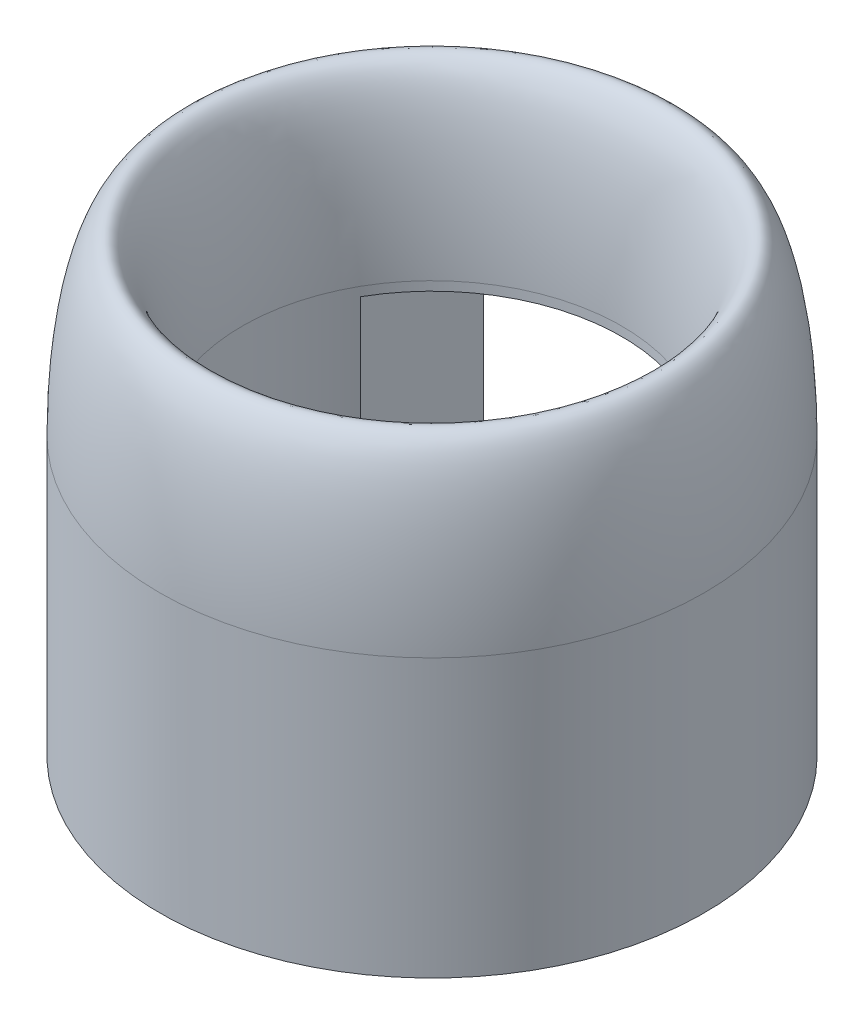
ISO-10303-21;
HEADER;
FILE_DESCRIPTION(('STEP AP214'),'2;1');
FILE_NAME('part.step','',(''),(''),'','','');
FILE_SCHEMA(('AUTOMOTIVE_DESIGN { 1 0 10303 214 1 1 1 1 }'));
ENDSEC;
DATA;
#1=APPLICATION_CONTEXT('core data for automotive mechanical design processes');
#2=APPLICATION_PROTOCOL_DEFINITION('international standard','automotive_design',2000,#1);
#3=PRODUCT_CONTEXT('',#1,'mechanical');
#4=PRODUCT('Part','Part','',(#3));
#5=PRODUCT_RELATED_PRODUCT_CATEGORY('part','',(#4));
#6=PRODUCT_DEFINITION_FORMATION('','',#4);
#7=PRODUCT_DEFINITION_CONTEXT('part definition',#1,'design');
#8=PRODUCT_DEFINITION('design','',#6,#7);
#9=PRODUCT_DEFINITION_SHAPE('','',#8);
#10=(LENGTH_UNIT() NAMED_UNIT(*) SI_UNIT(.MILLI.,.METRE.));
#11=(NAMED_UNIT(*) PLANE_ANGLE_UNIT() SI_UNIT($,.RADIAN.));
#12=(NAMED_UNIT(*) SI_UNIT($,.STERADIAN.) SOLID_ANGLE_UNIT());
#13=UNCERTAINTY_MEASURE_WITH_UNIT(LENGTH_MEASURE(1.E-05),#10,'distance_accuracy_value','');
#14=(GEOMETRIC_REPRESENTATION_CONTEXT(3) GLOBAL_UNCERTAINTY_ASSIGNED_CONTEXT((#13)) GLOBAL_UNIT_ASSIGNED_CONTEXT((#10,
#11,#12)) REPRESENTATION_CONTEXT('',''));
#15=CARTESIAN_POINT('',(0.,0.,0.));
#16=DIRECTION('',(0.,0.,1.));
#17=DIRECTION('',(1.,0.,0.));
#18=AXIS2_PLACEMENT_3D('',#15,#16,#17);
#19=CARTESIAN_POINT('',(0.,54.5,0.));
#20=DIRECTION('',(0.,-1.,0.));
#21=DIRECTION('',(0.,0.,-1.));
#22=AXIS2_PLACEMENT_3D('',#19,#20,#21);
#23=CYLINDRICAL_SURFACE('',#22,23.);
#24=CARTESIAN_POINT('',(0.,33.6,0.));
#25=DIRECTION('',(0.,1.,0.));
#26=DIRECTION('',(0.,0.,1.));
#27=AXIS2_PLACEMENT_3D('',#24,#25,#26);
#28=CIRCLE('',#27,23.);
#29=CARTESIAN_POINT('',(0.,33.6,23.));
#30=VERTEX_POINT('',#29);
#31=EDGE_CURVE('E129',#30,#30,#28,.T.);
#32=ORIENTED_EDGE('',*,*,#31,.T.);
#33=EDGE_LOOP('',(#32));
#34=FACE_BOUND('',#33,.T.);
#35=CARTESIAN_POINT('',(0.,32.5,0.));
#36=DIRECTION('',(0.,1.,0.));
#37=DIRECTION('',(0.,0.,1.));
#38=AXIS2_PLACEMENT_3D('',#35,#36,#37);
#39=CIRCLE('',#38,23.);
#40=CARTESIAN_POINT('',(20.,32.5,-11.3578166916006));
#41=VERTEX_POINT('',#40);
#42=CARTESIAN_POINT('',(-20.,32.5,-11.3578166916006));
#43=VERTEX_POINT('',#42);
#44=EDGE_CURVE('E11',#41,#43,#39,.T.);
#45=ORIENTED_EDGE('',*,*,#44,.F.);
#46=DIRECTION('',(0.,-1.,0.));
#47=VECTOR('',#46,1.);
#48=CARTESIAN_POINT('',(20.,32.5,-11.3578166916006));
#49=LINE('',#48,#47);
#50=CARTESIAN_POINT('',(20.,7.5,-11.3578166916006));
#51=VERTEX_POINT('',#50);
#52=EDGE_CURVE('E108',#41,#51,#49,.T.);
#53=ORIENTED_EDGE('',*,*,#52,.T.);
#54=CARTESIAN_POINT('',(0.,7.5,0.));
#55=DIRECTION('',(0.,1.,0.));
#56=DIRECTION('',(0.,0.,1.));
#57=AXIS2_PLACEMENT_3D('',#54,#55,#56);
#58=CIRCLE('',#57,23.);
#59=CARTESIAN_POINT('',(23.,7.5,0.));
#60=VERTEX_POINT('',#59);
#61=EDGE_CURVE('E71',#60,#51,#58,.T.);
#62=ORIENTED_EDGE('',*,*,#61,.F.);
#63=CARTESIAN_POINT('',(-23.,7.5,0.));
#64=VERTEX_POINT('',#63);
#65=EDGE_CURVE('E56',#64,#60,#58,.T.);
#66=ORIENTED_EDGE('',*,*,#65,.F.);
#67=CARTESIAN_POINT('',(-20.,7.5,-11.3578166916006));
#68=VERTEX_POINT('',#67);
#69=EDGE_CURVE('E111',#68,#64,#58,.T.);
#70=ORIENTED_EDGE('',*,*,#69,.F.);
#71=DIRECTION('',(0.,-1.,0.));
#72=VECTOR('',#71,1.);
#73=CARTESIAN_POINT('',(-20.,32.5,-11.3578166916006));
#74=LINE('',#73,#72);
#75=EDGE_CURVE('E63',#43,#68,#74,.T.);
#76=ORIENTED_EDGE('',*,*,#75,.F.);
#77=EDGE_LOOP('',(#45,#53,#62,#66,#70,#76));
#78=FACE_BOUND('',#77,.T.);
#79=ADVANCED_FACE('F47',(#34,#78),#23,.F.);
#80=CARTESIAN_POINT('',(0.,54.5,0.));
#81=DIRECTION('',(0.,-1.,0.));
#82=DIRECTION('',(0.,0.,-1.));
#83=AXIS2_PLACEMENT_3D('',#80,#81,#82);
#84=CYLINDRICAL_SURFACE('',#83,33.);
#85=DIRECTION('',(0.,-1.,0.));
#86=VECTOR('',#85,1.);
#87=CARTESIAN_POINT('',(20.,54.5,-26.2488094968134));
#88=LINE('',#87,#86);
#89=CARTESIAN_POINT('',(20.,32.5,-26.2488094968134));
#90=VERTEX_POINT('',#89);
#91=CARTESIAN_POINT('',(20.,7.5,-26.2488094968134));
#92=VERTEX_POINT('',#91);
#93=EDGE_CURVE('E116',#90,#92,#88,.T.);
#94=ORIENTED_EDGE('',*,*,#93,.F.);
#95=CARTESIAN_POINT('',(0.,32.5,0.));
#96=DIRECTION('',(0.,1.,0.));
#97=DIRECTION('',(0.,0.,1.));
#98=AXIS2_PLACEMENT_3D('',#95,#96,#97);
#99=CIRCLE('',#98,33.);
#100=CARTESIAN_POINT('',(-20.,32.5,-26.2488094968134));
#101=VERTEX_POINT('',#100);
#102=EDGE_CURVE('E126',#90,#101,#99,.T.);
#103=ORIENTED_EDGE('',*,*,#102,.T.);
#104=DIRECTION('',(0.,-1.,0.));
#105=VECTOR('',#104,1.);
#106=CARTESIAN_POINT('',(-20.,54.5,-26.2488094968134));
#107=LINE('',#106,#105);
#108=CARTESIAN_POINT('',(-20.,7.5,-26.2488094968134));
#109=VERTEX_POINT('',#108);
#110=EDGE_CURVE('E106',#109,#101,#107,.F.);
#111=ORIENTED_EDGE('',*,*,#110,.F.);
#112=CARTESIAN_POINT('',(0.,7.5,0.));
#113=DIRECTION('',(0.,1.,0.));
#114=DIRECTION('',(0.,0.,1.));
#115=AXIS2_PLACEMENT_3D('',#112,#113,#114);
#116=CIRCLE('',#115,33.);
#117=EDGE_CURVE('E123',#92,#109,#116,.T.);
#118=ORIENTED_EDGE('',*,*,#117,.F.);
#119=EDGE_LOOP('',(#94,#103,#111,#118));
#120=FACE_BOUND('',#119,.T.);
#121=CARTESIAN_POINT('',(0.,0.,0.));
#122=DIRECTION('',(0.,-1.,0.));
#123=DIRECTION('',(0.,0.,-1.));
#124=AXIS2_PLACEMENT_3D('',#121,#122,#123);
#125=CIRCLE('',#124,33.);
#126=CARTESIAN_POINT('',(0.,0.,-33.));
#127=VERTEX_POINT('',#126);
#128=EDGE_CURVE('E235',#127,#127,#125,.T.);
#129=ORIENTED_EDGE('',*,*,#128,.F.);
#130=EDGE_LOOP('',(#129));
#131=FACE_BOUND('',#130,.T.);
#132=CARTESIAN_POINT('',(0.,33.6,0.));
#133=DIRECTION('',(0.,1.,0.));
#134=DIRECTION('',(0.,0.,1.));
#135=AXIS2_PLACEMENT_3D('',#132,#133,#134);
#136=CIRCLE('',#135,33.);
#137=CARTESIAN_POINT('',(0.,33.6,33.));
#138=VERTEX_POINT('',#137);
#139=EDGE_CURVE('E364',#138,#138,#136,.T.);
#140=ORIENTED_EDGE('',*,*,#139,.F.);
#141=EDGE_LOOP('',(#140));
#142=FACE_BOUND('',#141,.T.);
#143=ADVANCED_FACE('F144',(#120,#131,#142),#84,.T.);
#144=CARTESIAN_POINT('',(0.,7.5,0.));
#145=DIRECTION('',(0.,1.,0.));
#146=DIRECTION('',(0.,0.,1.));
#147=AXIS2_PLACEMENT_3D('',#144,#145,#146);
#148=PLANE('',#147);
#149=ORIENTED_EDGE('',*,*,#61,.T.);
#150=DIRECTION('',(0.,0.,-1.));
#151=VECTOR('',#150,1.);
#152=CARTESIAN_POINT('',(20.,7.5,-33.));
#153=LINE('',#152,#151);
#154=EDGE_CURVE('E242',#51,#92,#153,.T.);
#155=ORIENTED_EDGE('',*,*,#154,.T.);
#156=ORIENTED_EDGE('',*,*,#117,.T.);
#157=DIRECTION('',(0.,0.,1.));
#158=VECTOR('',#157,1.);
#159=CARTESIAN_POINT('',(-20.,7.5,-33.));
#160=LINE('',#159,#158);
#161=EDGE_CURVE('E239',#109,#68,#160,.T.);
#162=ORIENTED_EDGE('',*,*,#161,.T.);
#163=ORIENTED_EDGE('',*,*,#69,.T.);
#164=CARTESIAN_POINT('',(-19.,7.5,0.));
#165=DIRECTION('',(0.,1.,0.));
#166=DIRECTION('',(0.,0.,1.));
#167=AXIS2_PLACEMENT_3D('',#164,#165,#166);
#168=CIRCLE('',#167,4.);
#169=EDGE_CURVE('E218',#64,#64,#168,.T.);
#170=ORIENTED_EDGE('',*,*,#169,.F.);
#171=ORIENTED_EDGE('',*,*,#65,.T.);
#172=CARTESIAN_POINT('',(19.,7.5,0.));
#173=DIRECTION('',(0.,1.,0.));
#174=DIRECTION('',(0.,0.,1.));
#175=AXIS2_PLACEMENT_3D('',#172,#173,#174);
#176=CIRCLE('',#175,4.);
#177=EDGE_CURVE('E222',#60,#60,#176,.T.);
#178=ORIENTED_EDGE('',*,*,#177,.F.);
#179=EDGE_LOOP('',(#149,#155,#156,#162,#163,#170,#171,#178));
#180=FACE_BOUND('',#179,.T.);
#181=CARTESIAN_POINT('',(0.,7.5,0.));
#182=DIRECTION('',(0.,1.,0.));
#183=DIRECTION('',(0.,0.,1.));
#184=AXIS2_PLACEMENT_3D('',#181,#182,#183);
#185=CIRCLE('',#184,5.5);
#186=CARTESIAN_POINT('',(0.,7.5,5.5));
#187=VERTEX_POINT('',#186);
#188=EDGE_CURVE('E186',#187,#187,#185,.T.);
#189=ORIENTED_EDGE('',*,*,#188,.F.);
#190=EDGE_LOOP('',(#189));
#191=FACE_BOUND('',#190,.T.);
#192=ADVANCED_FACE('F148',(#180,#191),#148,.T.);
#193=CARTESIAN_POINT('',(-19.,7.5,0.));
#194=DIRECTION('',(0.,-1.,0.));
#195=DIRECTION('',(0.,0.,-1.));
#196=AXIS2_PLACEMENT_3D('',#193,#194,#195);
#197=CYLINDRICAL_SURFACE('',#196,1.8);
#198=CARTESIAN_POINT('',(-19.,0.,0.));
#199=DIRECTION('',(0.,1.,0.));
#200=DIRECTION('',(0.,0.,1.));
#201=AXIS2_PLACEMENT_3D('',#198,#199,#200);
#202=CIRCLE('',#201,1.8);
#203=CARTESIAN_POINT('',(-19.,0.,1.8));
#204=VERTEX_POINT('',#203);
#205=EDGE_CURVE('E194',#204,#204,#202,.T.);
#206=ORIENTED_EDGE('',*,*,#205,.F.);
#207=EDGE_LOOP('',(#206));
#208=FACE_BOUND('',#207,.T.);
#209=CARTESIAN_POINT('',(-19.,1.5,0.));
#210=DIRECTION('',(0.,1.,0.));
#211=DIRECTION('',(0.,0.,1.));
#212=AXIS2_PLACEMENT_3D('',#209,#210,#211);
#213=CIRCLE('',#212,1.8);
#214=CARTESIAN_POINT('',(-19.,1.5,1.8));
#215=VERTEX_POINT('',#214);
#216=EDGE_CURVE('E197',#215,#215,#213,.T.);
#217=ORIENTED_EDGE('',*,*,#216,.T.);
#218=EDGE_LOOP('',(#217));
#219=FACE_BOUND('',#218,.T.);
#220=ADVANCED_FACE('F172',(#208,#219),#197,.F.);
#221=CARTESIAN_POINT('',(19.,7.5,0.));
#222=DIRECTION('',(0.,-1.,0.));
#223=DIRECTION('',(0.,0.,-1.));
#224=AXIS2_PLACEMENT_3D('',#221,#222,#223);
#225=CYLINDRICAL_SURFACE('',#224,1.8);
#226=CARTESIAN_POINT('',(19.,0.,0.));
#227=DIRECTION('',(0.,1.,0.));
#228=DIRECTION('',(0.,0.,-1.));
#229=AXIS2_PLACEMENT_3D('',#226,#227,#228);
#230=CIRCLE('',#229,1.8);
#231=CARTESIAN_POINT('',(19.,0.,-1.80000000000001));
#232=VERTEX_POINT('',#231);
#233=EDGE_CURVE('E188',#232,#232,#230,.T.);
#234=ORIENTED_EDGE('',*,*,#233,.F.);
#235=EDGE_LOOP('',(#234));
#236=FACE_BOUND('',#235,.T.);
#237=CARTESIAN_POINT('',(19.,1.5,0.));
#238=DIRECTION('',(0.,1.,0.));
#239=DIRECTION('',(0.,0.,1.));
#240=AXIS2_PLACEMENT_3D('',#237,#238,#239);
#241=CIRCLE('',#240,1.8);
#242=CARTESIAN_POINT('',(19.,1.5,1.8));
#243=VERTEX_POINT('',#242);
#244=EDGE_CURVE('E206',#243,#243,#241,.T.);
#245=ORIENTED_EDGE('',*,*,#244,.T.);
#246=EDGE_LOOP('',(#245));
#247=FACE_BOUND('',#246,.T.);
#248=ADVANCED_FACE('F169',(#236,#247),#225,.F.);
#249=CARTESIAN_POINT('',(0.,0.,0.));
#250=DIRECTION('',(0.,1.,0.));
#251=DIRECTION('',(0.,0.,1.));
#252=AXIS2_PLACEMENT_3D('',#249,#250,#251);
#253=PLANE('',#252);
#254=ORIENTED_EDGE('',*,*,#128,.T.);
#255=EDGE_LOOP('',(#254));
#256=FACE_BOUND('',#255,.T.);
#257=CARTESIAN_POINT('',(0.,0.,0.));
#258=DIRECTION('',(0.,1.,0.));
#259=DIRECTION('',(0.,0.,1.));
#260=AXIS2_PLACEMENT_3D('',#257,#258,#259);
#261=CIRCLE('',#260,5.5);
#262=CARTESIAN_POINT('',(0.,0.,5.5));
#263=VERTEX_POINT('',#262);
#264=EDGE_CURVE('E189',#263,#263,#261,.T.);
#265=ORIENTED_EDGE('',*,*,#264,.T.);
#266=EDGE_LOOP('',(#265));
#267=FACE_BOUND('',#266,.T.);
#268=ORIENTED_EDGE('',*,*,#233,.T.);
#269=EDGE_LOOP('',(#268));
#270=FACE_BOUND('',#269,.T.);
#271=ORIENTED_EDGE('',*,*,#205,.T.);
#272=EDGE_LOOP('',(#271));
#273=FACE_BOUND('',#272,.T.);
#274=ADVANCED_FACE('F49',(#256,#267,#270,#273),#253,.F.);
#275=CARTESIAN_POINT('',(0.,7.5,0.));
#276=DIRECTION('',(0.,-1.,0.));
#277=DIRECTION('',(0.,0.,-1.));
#278=AXIS2_PLACEMENT_3D('',#275,#276,#277);
#279=CYLINDRICAL_SURFACE('',#278,5.5);
#280=ORIENTED_EDGE('',*,*,#188,.T.);
#281=EDGE_LOOP('',(#280));
#282=FACE_BOUND('',#281,.T.);
#283=ORIENTED_EDGE('',*,*,#264,.F.);
#284=EDGE_LOOP('',(#283));
#285=FACE_BOUND('',#284,.T.);
#286=ADVANCED_FACE('F161',(#282,#285),#279,.F.);
#287=CARTESIAN_POINT('',(19.,1.5,0.));
#288=DIRECTION('',(0.,1.,0.));
#289=DIRECTION('',(0.,0.,1.));
#290=AXIS2_PLACEMENT_3D('',#287,#288,#289);
#291=CYLINDRICAL_SURFACE('',#290,4.);
#292=CARTESIAN_POINT('',(19.,1.5,0.));
#293=DIRECTION('',(0.,1.,0.));
#294=DIRECTION('',(0.,0.,1.));
#295=AXIS2_PLACEMENT_3D('',#292,#293,#294);
#296=CIRCLE('',#295,4.);
#297=CARTESIAN_POINT('',(19.,1.5,3.99999999999999));
#298=VERTEX_POINT('',#297);
#299=EDGE_CURVE('E200',#298,#298,#296,.T.);
#300=ORIENTED_EDGE('',*,*,#299,.F.);
#301=EDGE_LOOP('',(#300));
#302=FACE_BOUND('',#301,.T.);
#303=ORIENTED_EDGE('',*,*,#177,.T.);
#304=EDGE_LOOP('',(#303));
#305=FACE_BOUND('',#304,.T.);
#306=ADVANCED_FACE('F158',(#302,#305),#291,.F.);
#307=CARTESIAN_POINT('',(19.,1.5,0.));
#308=DIRECTION('',(0.,1.,0.));
#309=DIRECTION('',(0.,0.,1.));
#310=AXIS2_PLACEMENT_3D('',#307,#308,#309);
#311=PLANE('',#310);
#312=ORIENTED_EDGE('',*,*,#244,.F.);
#313=EDGE_LOOP('',(#312));
#314=FACE_BOUND('',#313,.T.);
#315=ORIENTED_EDGE('',*,*,#299,.T.);
#316=EDGE_LOOP('',(#315));
#317=FACE_BOUND('',#316,.T.);
#318=ADVANCED_FACE('F156',(#314,#317),#311,.T.);
#319=CARTESIAN_POINT('',(-19.,1.5,0.));
#320=DIRECTION('',(0.,1.,0.));
#321=DIRECTION('',(0.,0.,1.));
#322=AXIS2_PLACEMENT_3D('',#319,#320,#321);
#323=CYLINDRICAL_SURFACE('',#322,4.);
#324=CARTESIAN_POINT('',(-19.,1.5,0.));
#325=DIRECTION('',(0.,1.,0.));
#326=DIRECTION('',(0.,0.,1.));
#327=AXIS2_PLACEMENT_3D('',#324,#325,#326);
#328=CIRCLE('',#327,4.);
#329=CARTESIAN_POINT('',(-19.,1.5,4.));
#330=VERTEX_POINT('',#329);
#331=EDGE_CURVE('E209',#330,#330,#328,.T.);
#332=ORIENTED_EDGE('',*,*,#331,.F.);
#333=EDGE_LOOP('',(#332));
#334=FACE_BOUND('',#333,.T.);
#335=ORIENTED_EDGE('',*,*,#169,.T.);
#336=EDGE_LOOP('',(#335));
#337=FACE_BOUND('',#336,.T.);
#338=ADVANCED_FACE('F152',(#334,#337),#323,.F.);
#339=CARTESIAN_POINT('',(-19.,1.5,0.));
#340=DIRECTION('',(0.,1.,0.));
#341=DIRECTION('',(0.,0.,1.));
#342=AXIS2_PLACEMENT_3D('',#339,#340,#341);
#343=PLANE('',#342);
#344=ORIENTED_EDGE('',*,*,#216,.F.);
#345=EDGE_LOOP('',(#344));
#346=FACE_BOUND('',#345,.T.);
#347=ORIENTED_EDGE('',*,*,#331,.T.);
#348=EDGE_LOOP('',(#347));
#349=FACE_BOUND('',#348,.T.);
#350=ADVANCED_FACE('F138',(#346,#349),#343,.T.);
#351=CARTESIAN_POINT('',(-28.,33.6,0.));
#352=DIRECTION('',(0.,0.,-1.));
#353=DIRECTION('',(0.,1.,0.));
#354=AXIS2_PLACEMENT_3D('',#351,#352,#353);
#355=ELLIPSE('',#354,20.8,5.);
#356=CARTESIAN_POINT('',(0.,54.5,0.));
#357=DIRECTION('',(0.,1.,0.));
#358=AXIS1_PLACEMENT('',#356,#357);
#359=SURFACE_OF_REVOLUTION('',#355,#358);
#360=ORIENTED_EDGE('',*,*,#31,.F.);
#361=EDGE_LOOP('',(#360));
#362=FACE_BOUND('',#361,.T.);
#363=ORIENTED_EDGE('',*,*,#139,.T.);
#364=EDGE_LOOP('',(#363));
#365=FACE_BOUND('',#364,.T.);
#366=ADVANCED_FACE('F134',(#362,#365),#359,.T.);
#367=CARTESIAN_POINT('',(0.,32.5,0.));
#368=DIRECTION('',(0.,1.,0.));
#369=DIRECTION('',(0.,0.,1.));
#370=AXIS2_PLACEMENT_3D('',#367,#368,#369);
#371=PLANE('',#370);
#372=DIRECTION('',(0.,0.,-1.));
#373=VECTOR('',#372,1.);
#374=CARTESIAN_POINT('',(20.,32.5,-33.));
#375=LINE('',#374,#373);
#376=EDGE_CURVE('E102',#41,#90,#375,.T.);
#377=ORIENTED_EDGE('',*,*,#376,.F.);
#378=ORIENTED_EDGE('',*,*,#44,.T.);
#379=DIRECTION('',(0.,0.,1.));
#380=VECTOR('',#379,1.);
#381=CARTESIAN_POINT('',(-20.,32.5,-33.));
#382=LINE('',#381,#380);
#383=EDGE_CURVE('E100',#101,#43,#382,.T.);
#384=ORIENTED_EDGE('',*,*,#383,.F.);
#385=ORIENTED_EDGE('',*,*,#102,.F.);
#386=EDGE_LOOP('',(#377,#378,#384,#385));
#387=FACE_BOUND('',#386,.T.);
#388=ADVANCED_FACE('F99',(#387),#371,.F.);
#389=CARTESIAN_POINT('',(20.,32.5,-33.));
#390=DIRECTION('',(-1.,0.,0.));
#391=DIRECTION('',(0.,0.,1.));
#392=AXIS2_PLACEMENT_3D('',#389,#390,#391);
#393=PLANE('',#392);
#394=ORIENTED_EDGE('',*,*,#93,.T.);
#395=ORIENTED_EDGE('',*,*,#154,.F.);
#396=ORIENTED_EDGE('',*,*,#52,.F.);
#397=ORIENTED_EDGE('',*,*,#376,.T.);
#398=EDGE_LOOP('',(#394,#395,#396,#397));
#399=FACE_BOUND('',#398,.T.);
#400=ADVANCED_FACE('F140',(#399),#393,.T.);
#401=CARTESIAN_POINT('',(-20.,32.5,-33.));
#402=DIRECTION('',(1.,0.,0.));
#403=DIRECTION('',(0.,0.,-1.));
#404=AXIS2_PLACEMENT_3D('',#401,#402,#403);
#405=PLANE('',#404);
#406=ORIENTED_EDGE('',*,*,#110,.T.);
#407=ORIENTED_EDGE('',*,*,#383,.T.);
#408=ORIENTED_EDGE('',*,*,#75,.T.);
#409=ORIENTED_EDGE('',*,*,#161,.F.);
#410=EDGE_LOOP('',(#406,#407,#408,#409));
#411=FACE_BOUND('',#410,.T.);
#412=ADVANCED_FACE('F104',(#411),#405,.T.);
#413=CLOSED_SHELL('',(#79,#143,#192,#220,#248,#274,#286,#306,#318,#338,#350,#366,#388,#400,#412));
#414=MANIFOLD_SOLID_BREP('B2',#413);
#415=ADVANCED_BREP_SHAPE_REPRESENTATION('',(#18,#414),#14);
#416=SHAPE_DEFINITION_REPRESENTATION(#9,#415);
ENDSEC;
END-ISO-10303-21;
